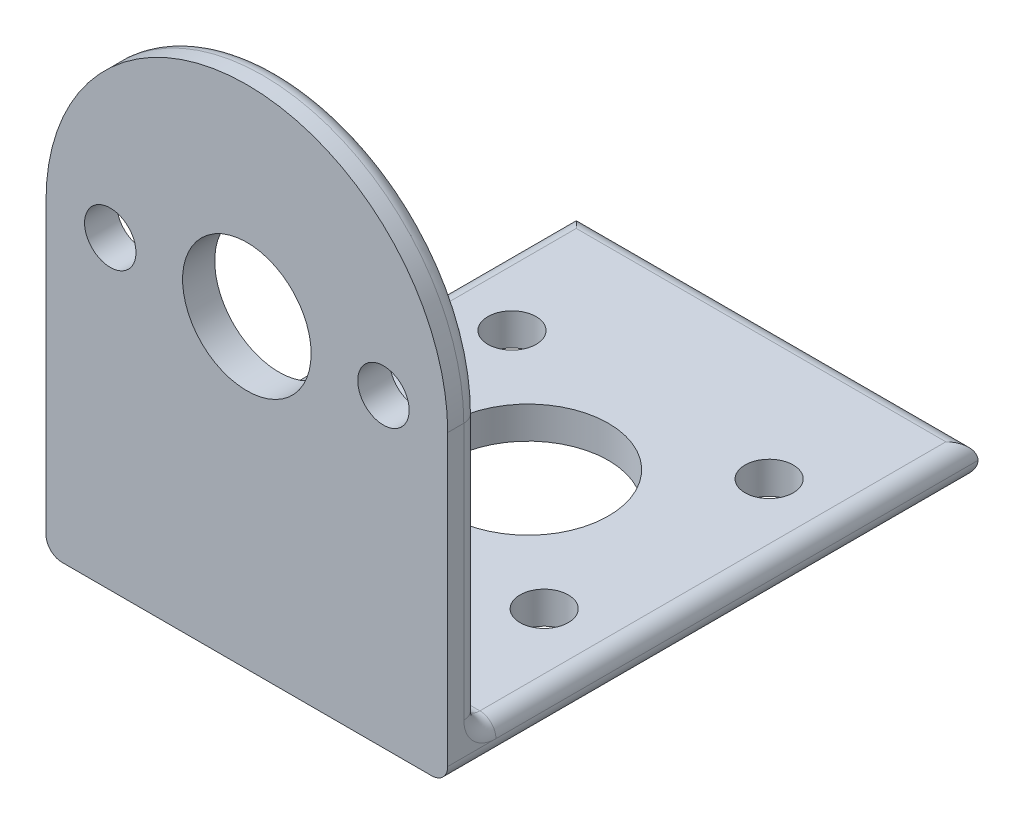
ISO-10303-21;
HEADER;
FILE_DESCRIPTION(('STEP AP214'),'2;1');
FILE_NAME('part.step','',(''),(''),'','','');
FILE_SCHEMA(('AUTOMOTIVE_DESIGN { 1 0 10303 214 1 1 1 1 }'));
ENDSEC;
DATA;
#1=APPLICATION_CONTEXT('core data for automotive mechanical design processes');
#2=APPLICATION_PROTOCOL_DEFINITION('international standard','automotive_design',2000,#1);
#3=PRODUCT_CONTEXT('',#1,'mechanical');
#4=PRODUCT('Part','Part','',(#3));
#5=PRODUCT_RELATED_PRODUCT_CATEGORY('part','',(#4));
#6=PRODUCT_DEFINITION_FORMATION('','',#4);
#7=PRODUCT_DEFINITION_CONTEXT('part definition',#1,'design');
#8=PRODUCT_DEFINITION('design','',#6,#7);
#9=PRODUCT_DEFINITION_SHAPE('','',#8);
#10=(LENGTH_UNIT() NAMED_UNIT(*) SI_UNIT(.MILLI.,.METRE.));
#11=(NAMED_UNIT(*) PLANE_ANGLE_UNIT() SI_UNIT($,.RADIAN.));
#12=(NAMED_UNIT(*) SI_UNIT($,.STERADIAN.) SOLID_ANGLE_UNIT());
#13=UNCERTAINTY_MEASURE_WITH_UNIT(LENGTH_MEASURE(1.E-05),#10,'distance_accuracy_value','');
#14=(GEOMETRIC_REPRESENTATION_CONTEXT(3) GLOBAL_UNCERTAINTY_ASSIGNED_CONTEXT((#13)) GLOBAL_UNIT_ASSIGNED_CONTEXT((#10,
#11,#12)) REPRESENTATION_CONTEXT('',''));
#15=CARTESIAN_POINT('',(0.,0.,0.));
#16=DIRECTION('',(0.,0.,1.));
#17=DIRECTION('',(1.,0.,0.));
#18=AXIS2_PLACEMENT_3D('',#15,#16,#17);
#19=CARTESIAN_POINT('',(25.,0.,2.));
#20=DIRECTION('',(0.,0.,-1.));
#21=DIRECTION('',(1.,0.,0.));
#22=AXIS2_PLACEMENT_3D('',#19,#20,#21);
#23=PLANE('',#22);
#24=CARTESIAN_POINT('',(4.,16.9999999999999,2.));
#25=DIRECTION('',(0.,0.,1.));
#26=DIRECTION('',(-1.,0.,0.));
#27=AXIS2_PLACEMENT_3D('',#24,#25,#26);
#28=CIRCLE('',#27,1.6);
#29=CARTESIAN_POINT('',(2.4,16.9999999999999,2.));
#30=VERTEX_POINT('',#29);
#31=EDGE_CURVE('E722',#30,#30,#28,.T.);
#32=ORIENTED_EDGE('',*,*,#31,.F.);
#33=EDGE_LOOP('',(#32));
#34=FACE_BOUND('',#33,.T.);
#35=CARTESIAN_POINT('',(21.,17.,2.));
#36=DIRECTION('',(0.,0.,1.));
#37=DIRECTION('',(1.,0.,0.));
#38=AXIS2_PLACEMENT_3D('',#35,#36,#37);
#39=CIRCLE('',#38,1.6);
#40=CARTESIAN_POINT('',(22.6,17.,2.));
#41=VERTEX_POINT('',#40);
#42=EDGE_CURVE('E714',#41,#41,#39,.T.);
#43=ORIENTED_EDGE('',*,*,#42,.F.);
#44=EDGE_LOOP('',(#43));
#45=FACE_BOUND('',#44,.T.);
#46=CARTESIAN_POINT('',(12.5,17.,2.));
#47=DIRECTION('',(0.,0.,1.));
#48=DIRECTION('',(1.,0.,0.));
#49=AXIS2_PLACEMENT_3D('',#46,#47,#48);
#50=CIRCLE('',#49,4.);
#51=CARTESIAN_POINT('',(16.5,17.,2.));
#52=VERTEX_POINT('',#51);
#53=EDGE_CURVE('E200',#52,#52,#50,.T.);
#54=ORIENTED_EDGE('',*,*,#53,.F.);
#55=EDGE_LOOP('',(#54));
#56=FACE_BOUND('',#55,.T.);
#57=DIRECTION('',(-1.,0.,0.));
#58=VECTOR('',#57,1.);
#59=CARTESIAN_POINT('',(25.,-2.,2.));
#60=LINE('',#59,#58);
#61=CARTESIAN_POINT('',(24.,-2.,2.));
#62=VERTEX_POINT('',#61);
#63=CARTESIAN_POINT('',(1.,-2.,2.));
#64=VERTEX_POINT('',#63);
#65=EDGE_CURVE('E262',#62,#64,#60,.T.);
#66=ORIENTED_EDGE('',*,*,#65,.F.);
#67=CARTESIAN_POINT('',(24.,-1.,2.));
#68=DIRECTION('',(0.,0.,1.));
#69=DIRECTION('',(1.,0.,0.));
#70=AXIS2_PLACEMENT_3D('',#67,#68,#69);
#71=CIRCLE('',#70,1.);
#72=CARTESIAN_POINT('',(25.,-1.,2.));
#73=VERTEX_POINT('',#72);
#74=EDGE_CURVE('E190',#73,#62,#71,.F.);
#75=ORIENTED_EDGE('',*,*,#74,.F.);
#76=DIRECTION('',(0.,1.,0.));
#77=VECTOR('',#76,1.);
#78=CARTESIAN_POINT('',(25.,0.,2.));
#79=LINE('',#78,#77);
#80=CARTESIAN_POINT('',(25.,17.,2.));
#81=VERTEX_POINT('',#80);
#82=EDGE_CURVE('E255',#73,#81,#79,.T.);
#83=ORIENTED_EDGE('',*,*,#82,.T.);
#84=CARTESIAN_POINT('',(12.5,17.,2.));
#85=DIRECTION('',(0.,0.,1.));
#86=DIRECTION('',(1.,0.,0.));
#87=AXIS2_PLACEMENT_3D('',#84,#85,#86);
#88=CIRCLE('',#87,12.5);
#89=CARTESIAN_POINT('',(0.,17.,2.));
#90=VERTEX_POINT('',#89);
#91=EDGE_CURVE('E248',#90,#81,#88,.F.);
#92=ORIENTED_EDGE('',*,*,#91,.F.);
#93=DIRECTION('',(0.,1.,0.));
#94=VECTOR('',#93,1.);
#95=CARTESIAN_POINT('',(0.,0.,2.));
#96=LINE('',#95,#94);
#97=CARTESIAN_POINT('',(0.,-1.,2.));
#98=VERTEX_POINT('',#97);
#99=EDGE_CURVE('E254',#98,#90,#96,.T.);
#100=ORIENTED_EDGE('',*,*,#99,.F.);
#101=CARTESIAN_POINT('',(1.,-1.,2.));
#102=DIRECTION('',(0.,0.,1.));
#103=DIRECTION('',(1.,0.,0.));
#104=AXIS2_PLACEMENT_3D('',#101,#102,#103);
#105=CIRCLE('',#104,1.);
#106=EDGE_CURVE('E180',#64,#98,#105,.F.);
#107=ORIENTED_EDGE('',*,*,#106,.F.);
#108=EDGE_LOOP('',(#66,#75,#83,#92,#100,#107));
#109=FACE_BOUND('',#108,.T.);
#110=ADVANCED_FACE('F49',(#34,#45,#56,#109),#23,.F.);
#111=CARTESIAN_POINT('',(25.,0.,0.));
#112=DIRECTION('',(0.,0.,-1.));
#113=DIRECTION('',(1.,0.,0.));
#114=AXIS2_PLACEMENT_3D('',#111,#112,#113);
#115=PLANE('',#114);
#116=CARTESIAN_POINT('',(4.,16.9999999999999,0.));
#117=DIRECTION('',(0.,0.,1.));
#118=DIRECTION('',(-1.,0.,0.));
#119=AXIS2_PLACEMENT_3D('',#116,#117,#118);
#120=CIRCLE('',#119,1.6);
#121=CARTESIAN_POINT('',(2.4,16.9999999999999,0.));
#122=VERTEX_POINT('',#121);
#123=EDGE_CURVE('E707',#122,#122,#120,.T.);
#124=ORIENTED_EDGE('',*,*,#123,.T.);
#125=EDGE_LOOP('',(#124));
#126=FACE_BOUND('',#125,.T.);
#127=CARTESIAN_POINT('',(21.,17.,0.));
#128=DIRECTION('',(0.,0.,1.));
#129=DIRECTION('',(1.,0.,0.));
#130=AXIS2_PLACEMENT_3D('',#127,#128,#129);
#131=CIRCLE('',#130,1.6);
#132=CARTESIAN_POINT('',(22.6,17.,0.));
#133=VERTEX_POINT('',#132);
#134=EDGE_CURVE('E719',#133,#133,#131,.T.);
#135=ORIENTED_EDGE('',*,*,#134,.T.);
#136=EDGE_LOOP('',(#135));
#137=FACE_BOUND('',#136,.T.);
#138=CARTESIAN_POINT('',(12.5,17.,0.));
#139=DIRECTION('',(0.,0.,1.));
#140=DIRECTION('',(1.,0.,0.));
#141=AXIS2_PLACEMENT_3D('',#138,#139,#140);
#142=CIRCLE('',#141,4.);
#143=CARTESIAN_POINT('',(16.5,17.,0.));
#144=VERTEX_POINT('',#143);
#145=EDGE_CURVE('E718',#144,#144,#142,.T.);
#146=ORIENTED_EDGE('',*,*,#145,.T.);
#147=EDGE_LOOP('',(#146));
#148=FACE_BOUND('',#147,.T.);
#149=DIRECTION('',(0.,1.,0.));
#150=VECTOR('',#149,1.);
#151=CARTESIAN_POINT('',(24.,17.,0.));
#152=LINE('',#151,#150);
#153=CARTESIAN_POINT('',(24.,1.,0.));
#154=VERTEX_POINT('',#153);
#155=CARTESIAN_POINT('',(24.,17.,0.));
#156=VERTEX_POINT('',#155);
#157=EDGE_CURVE('E273',#154,#156,#152,.T.);
#158=ORIENTED_EDGE('',*,*,#157,.F.);
#159=DIRECTION('',(-1.,0.,0.));
#160=VECTOR('',#159,1.);
#161=CARTESIAN_POINT('',(25.,1.,0.));
#162=LINE('',#161,#160);
#163=CARTESIAN_POINT('',(1.,1.,0.));
#164=VERTEX_POINT('',#163);
#165=EDGE_CURVE('E270',#164,#154,#162,.F.);
#166=ORIENTED_EDGE('',*,*,#165,.F.);
#167=DIRECTION('',(0.,1.,0.));
#168=VECTOR('',#167,1.);
#169=CARTESIAN_POINT('',(1.,0.,0.));
#170=LINE('',#169,#168);
#171=CARTESIAN_POINT('',(1.,17.,0.));
#172=VERTEX_POINT('',#171);
#173=EDGE_CURVE('E277',#172,#164,#170,.F.);
#174=ORIENTED_EDGE('',*,*,#173,.F.);
#175=CARTESIAN_POINT('',(12.5,17.,0.));
#176=DIRECTION('',(0.,0.,1.));
#177=DIRECTION('',(1.,0.,0.));
#178=AXIS2_PLACEMENT_3D('',#175,#176,#177);
#179=CIRCLE('',#178,11.5);
#180=EDGE_CURVE('E280',#156,#172,#179,.T.);
#181=ORIENTED_EDGE('',*,*,#180,.F.);
#182=EDGE_LOOP('',(#158,#166,#174,#181));
#183=FACE_BOUND('',#182,.T.);
#184=ADVANCED_FACE('F344',(#126,#137,#148,#183),#115,.T.);
#185=CARTESIAN_POINT('',(25.,0.,0.));
#186=DIRECTION('',(0.,1.,0.));
#187=DIRECTION('',(0.,0.,-1.));
#188=AXIS2_PLACEMENT_3D('',#185,#186,#187);
#189=PLANE('',#188);
#190=CARTESIAN_POINT('',(4.50000018958425,0.,-22.5));
#191=DIRECTION('',(0.,-1.,0.));
#192=DIRECTION('',(0.,0.,-1.));
#193=AXIS2_PLACEMENT_3D('',#190,#191,#192);
#194=CIRCLE('',#193,1.5);
#195=CARTESIAN_POINT('',(4.50000018958425,0.,-24.));
#196=VERTEX_POINT('',#195);
#197=EDGE_CURVE('E687',#196,#196,#194,.T.);
#198=ORIENTED_EDGE('',*,*,#197,.T.);
#199=EDGE_LOOP('',(#198));
#200=FACE_BOUND('',#199,.T.);
#201=CARTESIAN_POINT('',(20.5,0.,-8.50246306635849));
#202=DIRECTION('',(0.,-1.,0.));
#203=DIRECTION('',(0.,0.,-1.));
#204=AXIS2_PLACEMENT_3D('',#201,#202,#203);
#205=CIRCLE('',#204,1.5);
#206=CARTESIAN_POINT('',(20.5,0.,-10.0024630663585));
#207=VERTEX_POINT('',#206);
#208=EDGE_CURVE('E691',#207,#207,#205,.T.);
#209=ORIENTED_EDGE('',*,*,#208,.T.);
#210=EDGE_LOOP('',(#209));
#211=FACE_BOUND('',#210,.T.);
#212=CARTESIAN_POINT('',(4.50000018958425,0.,-8.5));
#213=DIRECTION('',(0.,-1.,0.));
#214=DIRECTION('',(0.,0.,-1.));
#215=AXIS2_PLACEMENT_3D('',#212,#213,#214);
#216=CIRCLE('',#215,1.5);
#217=CARTESIAN_POINT('',(4.50000018958425,0.,-10.));
#218=VERTEX_POINT('',#217);
#219=EDGE_CURVE('E695',#218,#218,#216,.T.);
#220=ORIENTED_EDGE('',*,*,#219,.T.);
#221=EDGE_LOOP('',(#220));
#222=FACE_BOUND('',#221,.T.);
#223=CARTESIAN_POINT('',(20.5,0.,-22.5024630663585));
#224=DIRECTION('',(0.,-1.,0.));
#225=DIRECTION('',(0.,0.,-1.));
#226=AXIS2_PLACEMENT_3D('',#223,#224,#225);
#227=CIRCLE('',#226,1.5);
#228=CARTESIAN_POINT('',(20.5,0.,-24.0024630663585));
#229=VERTEX_POINT('',#228);
#230=EDGE_CURVE('E698',#229,#229,#227,.T.);
#231=ORIENTED_EDGE('',*,*,#230,.T.);
#232=EDGE_LOOP('',(#231));
#233=FACE_BOUND('',#232,.T.);
#234=DIRECTION('',(-1.,0.,0.));
#235=VECTOR('',#234,1.);
#236=CARTESIAN_POINT('',(0.,0.,-1.));
#237=LINE('',#236,#235);
#238=CARTESIAN_POINT('',(24.,0.,-1.));
#239=VERTEX_POINT('',#238);
#240=CARTESIAN_POINT('',(1.,0.,-1.));
#241=VERTEX_POINT('',#240);
#242=EDGE_CURVE('E174',#239,#241,#237,.T.);
#243=ORIENTED_EDGE('',*,*,#242,.F.);
#244=DIRECTION('',(0.,0.,1.));
#245=VECTOR('',#244,1.);
#246=CARTESIAN_POINT('',(24.,0.,0.));
#247=LINE('',#246,#245);
#248=CARTESIAN_POINT('',(24.,0.,-30.));
#249=VERTEX_POINT('',#248);
#250=EDGE_CURVE('E179',#249,#239,#247,.T.);
#251=ORIENTED_EDGE('',*,*,#250,.F.);
#252=DIRECTION('',(-1.,0.,0.));
#253=VECTOR('',#252,1.);
#254=CARTESIAN_POINT('',(25.,0.,-30.));
#255=LINE('',#254,#253);
#256=CARTESIAN_POINT('',(1.,0.,-30.));
#257=VERTEX_POINT('',#256);
#258=EDGE_CURVE('E60',#257,#249,#255,.F.);
#259=ORIENTED_EDGE('',*,*,#258,.F.);
#260=DIRECTION('',(0.,0.,1.));
#261=VECTOR('',#260,1.);
#262=CARTESIAN_POINT('',(1.,0.,0.));
#263=LINE('',#262,#261);
#264=EDGE_CURVE('E11',#241,#257,#263,.F.);
#265=ORIENTED_EDGE('',*,*,#264,.F.);
#266=EDGE_LOOP('',(#243,#251,#259,#265));
#267=FACE_BOUND('',#266,.T.);
#268=CARTESIAN_POINT('',(12.5,0.,-15.5));
#269=DIRECTION('',(0.,-1.,0.));
#270=DIRECTION('',(0.,0.,-1.));
#271=AXIS2_PLACEMENT_3D('',#268,#269,#270);
#272=CIRCLE('',#271,5.);
#273=CARTESIAN_POINT('',(12.5,0.,-20.5));
#274=VERTEX_POINT('',#273);
#275=EDGE_CURVE('E231',#274,#274,#272,.T.);
#276=ORIENTED_EDGE('',*,*,#275,.T.);
#277=EDGE_LOOP('',(#276));
#278=FACE_BOUND('',#277,.T.);
#279=ADVANCED_FACE('F171',(#200,#211,#222,#233,#267,#278),#189,.T.);
#280=CARTESIAN_POINT('',(25.,-2.,0.));
#281=DIRECTION('',(0.,1.,0.));
#282=DIRECTION('',(0.,0.,-1.));
#283=AXIS2_PLACEMENT_3D('',#280,#281,#282);
#284=PLANE('',#283);
#285=CARTESIAN_POINT('',(4.50000018958425,-2.00000000000001,-22.5));
#286=DIRECTION('',(0.,-1.,0.));
#287=DIRECTION('',(0.,0.,-1.));
#288=AXIS2_PLACEMENT_3D('',#285,#286,#287);
#289=CIRCLE('',#288,1.5);
#290=CARTESIAN_POINT('',(4.50000018958425,-2.00000000000001,-24.));
#291=VERTEX_POINT('',#290);
#292=EDGE_CURVE('E702',#291,#291,#289,.T.);
#293=ORIENTED_EDGE('',*,*,#292,.F.);
#294=EDGE_LOOP('',(#293));
#295=FACE_BOUND('',#294,.T.);
#296=CARTESIAN_POINT('',(20.5,-2.00000000000001,-8.50246306635849));
#297=DIRECTION('',(0.,-1.,0.));
#298=DIRECTION('',(0.,0.,-1.));
#299=AXIS2_PLACEMENT_3D('',#296,#297,#298);
#300=CIRCLE('',#299,1.5);
#301=CARTESIAN_POINT('',(20.5,-2.00000000000001,-10.0024630663585));
#302=VERTEX_POINT('',#301);
#303=EDGE_CURVE('E744',#302,#302,#300,.T.);
#304=ORIENTED_EDGE('',*,*,#303,.F.);
#305=EDGE_LOOP('',(#304));
#306=FACE_BOUND('',#305,.T.);
#307=CARTESIAN_POINT('',(4.50000018958425,-2.00000000000001,-8.5));
#308=DIRECTION('',(0.,-1.,0.));
#309=DIRECTION('',(0.,0.,-1.));
#310=AXIS2_PLACEMENT_3D('',#307,#308,#309);
#311=CIRCLE('',#310,1.5);
#312=CARTESIAN_POINT('',(4.50000018958425,-2.00000000000001,-10.));
#313=VERTEX_POINT('',#312);
#314=EDGE_CURVE('E754',#313,#313,#311,.T.);
#315=ORIENTED_EDGE('',*,*,#314,.F.);
#316=EDGE_LOOP('',(#315));
#317=FACE_BOUND('',#316,.T.);
#318=CARTESIAN_POINT('',(20.5,-2.00000000000001,-22.5024630663585));
#319=DIRECTION('',(0.,-1.,0.));
#320=DIRECTION('',(0.,0.,-1.));
#321=AXIS2_PLACEMENT_3D('',#318,#319,#320);
#322=CIRCLE('',#321,1.5);
#323=CARTESIAN_POINT('',(20.5,-2.00000000000001,-24.0024630663585));
#324=VERTEX_POINT('',#323);
#325=EDGE_CURVE('E701',#324,#324,#322,.T.);
#326=ORIENTED_EDGE('',*,*,#325,.F.);
#327=EDGE_LOOP('',(#326));
#328=FACE_BOUND('',#327,.T.);
#329=CARTESIAN_POINT('',(12.5,-2.00000000000001,-15.5));
#330=DIRECTION('',(0.,-1.,0.));
#331=DIRECTION('',(0.,0.,-1.));
#332=AXIS2_PLACEMENT_3D('',#329,#330,#331);
#333=CIRCLE('',#332,5.);
#334=CARTESIAN_POINT('',(12.5,-2.00000000000001,-20.5));
#335=VERTEX_POINT('',#334);
#336=EDGE_CURVE('E240',#335,#335,#333,.T.);
#337=ORIENTED_EDGE('',*,*,#336,.F.);
#338=EDGE_LOOP('',(#337));
#339=FACE_BOUND('',#338,.T.);
#340=DIRECTION('',(-1.,0.,0.));
#341=VECTOR('',#340,1.);
#342=CARTESIAN_POINT('',(0.,-2.,-30.));
#343=LINE('',#342,#341);
#344=CARTESIAN_POINT('',(24.,-2.,-30.));
#345=VERTEX_POINT('',#344);
#346=CARTESIAN_POINT('',(1.,-2.,-30.));
#347=VERTEX_POINT('',#346);
#348=EDGE_CURVE('E309',#345,#347,#343,.T.);
#349=ORIENTED_EDGE('',*,*,#348,.F.);
#350=DIRECTION('',(0.,0.,1.));
#351=VECTOR('',#350,1.);
#352=CARTESIAN_POINT('',(24.,-2.,0.));
#353=LINE('',#352,#351);
#354=EDGE_CURVE('E312',#62,#345,#353,.F.);
#355=ORIENTED_EDGE('',*,*,#354,.F.);
#356=ORIENTED_EDGE('',*,*,#65,.T.);
#357=DIRECTION('',(0.,0.,1.));
#358=VECTOR('',#357,1.);
#359=CARTESIAN_POINT('',(1.,-2.,2.));
#360=LINE('',#359,#358);
#361=EDGE_CURVE('E315',#347,#64,#360,.T.);
#362=ORIENTED_EDGE('',*,*,#361,.F.);
#363=EDGE_LOOP('',(#349,#355,#356,#362));
#364=FACE_BOUND('',#363,.T.);
#365=ADVANCED_FACE('F330',(#295,#306,#317,#328,#339,#364),#284,.F.);
#366=CARTESIAN_POINT('',(25.,0.,0.));
#367=DIRECTION('',(-1.,0.,0.));
#368=DIRECTION('',(0.,0.,-1.));
#369=AXIS2_PLACEMENT_3D('',#366,#367,#368);
#370=PLANE('',#369);
#371=DIRECTION('',(0.,0.,1.));
#372=VECTOR('',#371,1.);
#373=CARTESIAN_POINT('',(25.,17.,0.));
#374=LINE('',#373,#372);
#375=CARTESIAN_POINT('',(25.,17.,1.));
#376=VERTEX_POINT('',#375);
#377=EDGE_CURVE('E92',#376,#81,#374,.T.);
#378=ORIENTED_EDGE('',*,*,#377,.T.);
#379=ORIENTED_EDGE('',*,*,#82,.F.);
#380=DIRECTION('',(0.,0.,1.));
#381=VECTOR('',#380,1.);
#382=CARTESIAN_POINT('',(25.,-1.,0.));
#383=LINE('',#382,#381);
#384=CARTESIAN_POINT('',(25.,-1.,-1.));
#385=VERTEX_POINT('',#384);
#386=EDGE_CURVE('E298',#385,#73,#383,.T.);
#387=ORIENTED_EDGE('',*,*,#386,.F.);
#388=CARTESIAN_POINT('',(25.,1.,-1.));
#389=DIRECTION('',(1.,0.,0.));
#390=DIRECTION('',(0.,0.,-1.));
#391=AXIS2_PLACEMENT_3D('',#388,#389,#390);
#392=CIRCLE('',#391,2.);
#393=CARTESIAN_POINT('',(25.,1.,1.));
#394=VERTEX_POINT('',#393);
#395=EDGE_CURVE('E301',#385,#394,#392,.F.);
#396=ORIENTED_EDGE('',*,*,#395,.T.);
#397=DIRECTION('',(0.,1.,0.));
#398=VECTOR('',#397,1.);
#399=CARTESIAN_POINT('',(25.,0.,1.));
#400=LINE('',#399,#398);
#401=EDGE_CURVE('E305',#376,#394,#400,.F.);
#402=ORIENTED_EDGE('',*,*,#401,.F.);
#403=EDGE_LOOP('',(#378,#379,#387,#396,#402));
#404=FACE_BOUND('',#403,.T.);
#405=ADVANCED_FACE('F594',(#404),#370,.F.);
#406=CARTESIAN_POINT('',(0.,0.,0.));
#407=DIRECTION('',(-1.,0.,0.));
#408=DIRECTION('',(0.,0.,-1.));
#409=AXIS2_PLACEMENT_3D('',#406,#407,#408);
#410=PLANE('',#409);
#411=CARTESIAN_POINT('',(0.,1.,-1.));
#412=DIRECTION('',(1.,0.,0.));
#413=DIRECTION('',(0.,0.,-1.));
#414=AXIS2_PLACEMENT_3D('',#411,#412,#413);
#415=CIRCLE('',#414,2.);
#416=CARTESIAN_POINT('',(0.,1.,1.));
#417=VERTEX_POINT('',#416);
#418=CARTESIAN_POINT('',(0.,-1.,-1.));
#419=VERTEX_POINT('',#418);
#420=EDGE_CURVE('E287',#417,#419,#415,.T.);
#421=ORIENTED_EDGE('',*,*,#420,.T.);
#422=DIRECTION('',(0.,0.,1.));
#423=VECTOR('',#422,1.);
#424=CARTESIAN_POINT('',(0.,-1.,-31.));
#425=LINE('',#424,#423);
#426=EDGE_CURVE('E291',#98,#419,#425,.F.);
#427=ORIENTED_EDGE('',*,*,#426,.F.);
#428=ORIENTED_EDGE('',*,*,#99,.T.);
#429=DIRECTION('',(0.,0.,1.));
#430=VECTOR('',#429,1.);
#431=CARTESIAN_POINT('',(0.,17.,0.));
#432=LINE('',#431,#430);
#433=CARTESIAN_POINT('',(0.,17.,1.));
#434=VERTEX_POINT('',#433);
#435=EDGE_CURVE('E259',#434,#90,#432,.T.);
#436=ORIENTED_EDGE('',*,*,#435,.F.);
#437=DIRECTION('',(0.,1.,0.));
#438=VECTOR('',#437,1.);
#439=CARTESIAN_POINT('',(0.,0.,1.));
#440=LINE('',#439,#438);
#441=EDGE_CURVE('E294',#417,#434,#440,.T.);
#442=ORIENTED_EDGE('',*,*,#441,.F.);
#443=EDGE_LOOP('',(#421,#427,#428,#436,#442));
#444=FACE_BOUND('',#443,.T.);
#445=ADVANCED_FACE('F335',(#444),#410,.T.);
#446=CARTESIAN_POINT('',(12.5,17.,40.6684626019706));
#447=DIRECTION('',(0.,0.,-1.));
#448=DIRECTION('',(1.,0.,0.));
#449=AXIS2_PLACEMENT_3D('',#446,#447,#448);
#450=CYLINDRICAL_SURFACE('',#449,12.5);
#451=ORIENTED_EDGE('',*,*,#435,.T.);
#452=ORIENTED_EDGE('',*,*,#91,.T.);
#453=ORIENTED_EDGE('',*,*,#377,.F.);
#454=CARTESIAN_POINT('',(12.5,17.,1.));
#455=DIRECTION('',(0.,0.,1.));
#456=DIRECTION('',(1.,0.,0.));
#457=AXIS2_PLACEMENT_3D('',#454,#455,#456);
#458=CIRCLE('',#457,12.5);
#459=EDGE_CURVE('E284',#434,#376,#458,.F.);
#460=ORIENTED_EDGE('',*,*,#459,.F.);
#461=EDGE_LOOP('',(#451,#452,#453,#460));
#462=FACE_BOUND('',#461,.T.);
#463=ADVANCED_FACE('F573',(#462),#450,.T.);
#464=CARTESIAN_POINT('',(12.5,-2.00000000000001,-15.5));
#465=DIRECTION('',(0.,1.,0.));
#466=DIRECTION('',(0.,0.,-1.));
#467=AXIS2_PLACEMENT_3D('',#464,#465,#466);
#468=CYLINDRICAL_SURFACE('',#467,5.);
#469=ORIENTED_EDGE('',*,*,#336,.T.);
#470=EDGE_LOOP('',(#469));
#471=FACE_BOUND('',#470,.T.);
#472=ORIENTED_EDGE('',*,*,#275,.F.);
#473=EDGE_LOOP('',(#472));
#474=FACE_BOUND('',#473,.T.);
#475=ADVANCED_FACE('F564',(#471,#474),#468,.F.);
#476=CARTESIAN_POINT('',(25.,-1.,-30.));
#477=DIRECTION('',(1.,0.,0.));
#478=DIRECTION('',(0.,0.,1.));
#479=AXIS2_PLACEMENT_3D('',#476,#477,#478);
#480=CYLINDRICAL_SURFACE('',#479,1.);
#481=CARTESIAN_POINT('',(1.,-1.,-30.));
#482=DIRECTION('',(-0.707106781186547,0.,0.707106781186547));
#483=DIRECTION('',(0.707106781186547,0.,0.707106781186547));
#484=AXIS2_PLACEMENT_3D('',#481,#482,#483);
#485=ELLIPSE('',#484,1.41421356237309,1.);
#486=CARTESIAN_POINT('',(0.,-1.,-31.));
#487=VERTEX_POINT('',#486);
#488=EDGE_CURVE('E222',#347,#487,#485,.F.);
#489=ORIENTED_EDGE('',*,*,#488,.T.);
#490=DIRECTION('',(-1.,0.,0.));
#491=VECTOR('',#490,1.);
#492=CARTESIAN_POINT('',(25.,-1.,-31.));
#493=LINE('',#492,#491);
#494=CARTESIAN_POINT('',(25.,-1.,-31.));
#495=VERTEX_POINT('',#494);
#496=EDGE_CURVE('E225',#487,#495,#493,.F.);
#497=ORIENTED_EDGE('',*,*,#496,.T.);
#498=CARTESIAN_POINT('',(24.,-1.,-30.));
#499=DIRECTION('',(-0.707106781186547,0.,-0.707106781186547));
#500=DIRECTION('',(0.707106781186547,0.,-0.707106781186547));
#501=AXIS2_PLACEMENT_3D('',#498,#499,#500);
#502=ELLIPSE('',#501,1.41421356237309,1.);
#503=EDGE_CURVE('E53',#495,#345,#502,.T.);
#504=ORIENTED_EDGE('',*,*,#503,.T.);
#505=ORIENTED_EDGE('',*,*,#348,.T.);
#506=EDGE_LOOP('',(#489,#497,#504,#505));
#507=FACE_BOUND('',#506,.T.);
#508=ADVANCED_FACE('F51',(#507),#480,.T.);
#509=CARTESIAN_POINT('',(24.,-1.,0.));
#510=DIRECTION('',(0.,0.,1.));
#511=DIRECTION('',(0.,1.,0.));
#512=AXIS2_PLACEMENT_3D('',#509,#510,#511);
#513=CYLINDRICAL_SURFACE('',#512,1.);
#514=ORIENTED_EDGE('',*,*,#74,.T.);
#515=ORIENTED_EDGE('',*,*,#354,.T.);
#516=ORIENTED_EDGE('',*,*,#503,.F.);
#517=DIRECTION('',(0.,0.,1.));
#518=VECTOR('',#517,1.);
#519=CARTESIAN_POINT('',(25.,-1.,0.));
#520=LINE('',#519,#518);
#521=EDGE_CURVE('E218',#495,#385,#520,.T.);
#522=ORIENTED_EDGE('',*,*,#521,.T.);
#523=ORIENTED_EDGE('',*,*,#386,.T.);
#524=EDGE_LOOP('',(#514,#515,#516,#522,#523));
#525=FACE_BOUND('',#524,.T.);
#526=ADVANCED_FACE('F322',(#525),#513,.T.);
#527=CARTESIAN_POINT('',(25.,-1.,-30.));
#528=DIRECTION('',(-1.,0.,0.));
#529=DIRECTION('',(0.,0.,-1.));
#530=AXIS2_PLACEMENT_3D('',#527,#528,#529);
#531=CYLINDRICAL_SURFACE('',#530,1.);
#532=CARTESIAN_POINT('',(1.,-1.,-30.));
#533=DIRECTION('',(0.707106781186547,0.,-0.707106781186547));
#534=DIRECTION('',(-0.707106781186547,0.,-0.707106781186547));
#535=AXIS2_PLACEMENT_3D('',#532,#533,#534);
#536=ELLIPSE('',#535,1.41421356237309,1.);
#537=EDGE_CURVE('E69',#487,#257,#536,.T.);
#538=ORIENTED_EDGE('',*,*,#537,.T.);
#539=ORIENTED_EDGE('',*,*,#258,.T.);
#540=CARTESIAN_POINT('',(24.,-1.,-30.));
#541=DIRECTION('',(0.707106781186547,0.,0.707106781186547));
#542=DIRECTION('',(0.707106781186547,0.,-0.707106781186547));
#543=AXIS2_PLACEMENT_3D('',#540,#541,#542);
#544=ELLIPSE('',#543,1.41421356237309,1.);
#545=EDGE_CURVE('E83',#249,#495,#544,.F.);
#546=ORIENTED_EDGE('',*,*,#545,.T.);
#547=ORIENTED_EDGE('',*,*,#496,.F.);
#548=EDGE_LOOP('',(#538,#539,#546,#547));
#549=FACE_BOUND('',#548,.T.);
#550=ADVANCED_FACE('F352',(#549),#531,.T.);
#551=CARTESIAN_POINT('',(1.,-1.,0.));
#552=DIRECTION('',(0.,0.,-1.));
#553=DIRECTION('',(0.,-1.,0.));
#554=AXIS2_PLACEMENT_3D('',#551,#552,#553);
#555=CYLINDRICAL_SURFACE('',#554,1.);
#556=ORIENTED_EDGE('',*,*,#361,.T.);
#557=ORIENTED_EDGE('',*,*,#106,.T.);
#558=ORIENTED_EDGE('',*,*,#426,.T.);
#559=DIRECTION('',(0.,0.,1.));
#560=VECTOR('',#559,1.);
#561=CARTESIAN_POINT('',(0.,-1.,-31.));
#562=LINE('',#561,#560);
#563=EDGE_CURVE('E80',#419,#487,#562,.F.);
#564=ORIENTED_EDGE('',*,*,#563,.T.);
#565=ORIENTED_EDGE('',*,*,#488,.F.);
#566=EDGE_LOOP('',(#556,#557,#558,#564,#565));
#567=FACE_BOUND('',#566,.T.);
#568=ADVANCED_FACE('F331',(#567),#555,.T.);
#569=CARTESIAN_POINT('',(24.,-1.,0.));
#570=DIRECTION('',(0.,0.,-1.));
#571=DIRECTION('',(0.,-1.,0.));
#572=AXIS2_PLACEMENT_3D('',#569,#570,#571);
#573=CYLINDRICAL_SURFACE('',#572,1.);
#574=ORIENTED_EDGE('',*,*,#545,.F.);
#575=ORIENTED_EDGE('',*,*,#250,.T.);
#576=CARTESIAN_POINT('',(24.,-1.,-1.));
#577=DIRECTION('',(0.,0.,-1.));
#578=DIRECTION('',(0.,1.,0.));
#579=AXIS2_PLACEMENT_3D('',#576,#577,#578);
#580=CIRCLE('',#579,1.);
#581=EDGE_CURVE('E209',#239,#385,#580,.T.);
#582=ORIENTED_EDGE('',*,*,#581,.T.);
#583=ORIENTED_EDGE('',*,*,#521,.F.);
#584=EDGE_LOOP('',(#574,#575,#582,#583));
#585=FACE_BOUND('',#584,.T.);
#586=ADVANCED_FACE('F351',(#585),#573,.T.);
#587=CARTESIAN_POINT('',(25.,1.,-1.));
#588=DIRECTION('',(1.,0.,0.));
#589=DIRECTION('',(0.,0.,1.));
#590=AXIS2_PLACEMENT_3D('',#587,#588,#589);
#591=CYLINDRICAL_SURFACE('',#590,1.);
#592=CARTESIAN_POINT('',(1.,1.,-1.));
#593=DIRECTION('',(1.,0.,0.));
#594=DIRECTION('',(0.,0.,-1.));
#595=AXIS2_PLACEMENT_3D('',#592,#593,#594);
#596=CIRCLE('',#595,1.);
#597=EDGE_CURVE('E156',#241,#164,#596,.F.);
#598=ORIENTED_EDGE('',*,*,#597,.T.);
#599=ORIENTED_EDGE('',*,*,#165,.T.);
#600=CARTESIAN_POINT('',(24.,1.,-1.));
#601=DIRECTION('',(1.,0.,0.));
#602=DIRECTION('',(0.,0.,-1.));
#603=AXIS2_PLACEMENT_3D('',#600,#601,#602);
#604=CIRCLE('',#603,1.);
#605=EDGE_CURVE('E167',#154,#239,#604,.T.);
#606=ORIENTED_EDGE('',*,*,#605,.T.);
#607=ORIENTED_EDGE('',*,*,#242,.T.);
#608=EDGE_LOOP('',(#598,#599,#606,#607));
#609=FACE_BOUND('',#608,.T.);
#610=ADVANCED_FACE('F175',(#609),#591,.F.);
#611=CARTESIAN_POINT('',(1.,-1.,0.));
#612=DIRECTION('',(0.,0.,1.));
#613=DIRECTION('',(0.,1.,0.));
#614=AXIS2_PLACEMENT_3D('',#611,#612,#613);
#615=CYLINDRICAL_SURFACE('',#614,1.);
#616=ORIENTED_EDGE('',*,*,#537,.F.);
#617=ORIENTED_EDGE('',*,*,#563,.F.);
#618=CARTESIAN_POINT('',(1.,-1.,-1.));
#619=DIRECTION('',(0.,0.,-1.));
#620=DIRECTION('',(0.,1.,0.));
#621=AXIS2_PLACEMENT_3D('',#618,#619,#620);
#622=CIRCLE('',#621,1.);
#623=EDGE_CURVE('E148',#419,#241,#622,.T.);
#624=ORIENTED_EDGE('',*,*,#623,.T.);
#625=ORIENTED_EDGE('',*,*,#264,.T.);
#626=EDGE_LOOP('',(#616,#617,#624,#625));
#627=FACE_BOUND('',#626,.T.);
#628=ADVANCED_FACE('F150',(#627),#615,.T.);
#629=CARTESIAN_POINT('',(24.,1.,-1.));
#630=DIRECTION('',(-1.,0.,0.));
#631=DIRECTION('',(0.,0.,-1.));
#632=AXIS2_PLACEMENT_3D('',#629,#630,#631);
#633=TOROIDAL_SURFACE('',#632,2.,1.);
#634=ORIENTED_EDGE('',*,*,#581,.F.);
#635=ORIENTED_EDGE('',*,*,#605,.F.);
#636=CARTESIAN_POINT('',(24.,1.,1.));
#637=DIRECTION('',(0.,1.,0.));
#638=DIRECTION('',(0.,0.,1.));
#639=AXIS2_PLACEMENT_3D('',#636,#637,#638);
#640=CIRCLE('',#639,1.);
#641=EDGE_CURVE('E157',#154,#394,#640,.F.);
#642=ORIENTED_EDGE('',*,*,#641,.T.);
#643=ORIENTED_EDGE('',*,*,#395,.F.);
#644=EDGE_LOOP('',(#634,#635,#642,#643));
#645=FACE_BOUND('',#644,.T.);
#646=ADVANCED_FACE('F349',(#645),#633,.T.);
#647=CARTESIAN_POINT('',(1.,1.,-1.));
#648=DIRECTION('',(-1.,0.,0.));
#649=DIRECTION('',(0.,0.,-1.));
#650=AXIS2_PLACEMENT_3D('',#647,#648,#649);
#651=TOROIDAL_SURFACE('',#650,2.,1.);
#652=ORIENTED_EDGE('',*,*,#623,.F.);
#653=ORIENTED_EDGE('',*,*,#420,.F.);
#654=CARTESIAN_POINT('',(1.,1.,1.));
#655=DIRECTION('',(0.,1.,0.));
#656=DIRECTION('',(0.,0.,1.));
#657=AXIS2_PLACEMENT_3D('',#654,#655,#656);
#658=CIRCLE('',#657,1.);
#659=EDGE_CURVE('E161',#417,#164,#658,.F.);
#660=ORIENTED_EDGE('',*,*,#659,.T.);
#661=ORIENTED_EDGE('',*,*,#597,.F.);
#662=EDGE_LOOP('',(#652,#653,#660,#661));
#663=FACE_BOUND('',#662,.T.);
#664=ADVANCED_FACE('F160',(#663),#651,.T.);
#665=CARTESIAN_POINT('',(24.,0.,1.));
#666=DIRECTION('',(0.,-1.,0.));
#667=DIRECTION('',(0.,0.,1.));
#668=AXIS2_PLACEMENT_3D('',#665,#666,#667);
#669=CYLINDRICAL_SURFACE('',#668,1.);
#670=ORIENTED_EDGE('',*,*,#641,.F.);
#671=ORIENTED_EDGE('',*,*,#157,.T.);
#672=CARTESIAN_POINT('',(24.,17.,1.));
#673=DIRECTION('',(0.,-1.,0.));
#674=DIRECTION('',(0.,0.,-1.));
#675=AXIS2_PLACEMENT_3D('',#672,#673,#674);
#676=CIRCLE('',#675,1.);
#677=EDGE_CURVE('E199',#156,#376,#676,.T.);
#678=ORIENTED_EDGE('',*,*,#677,.T.);
#679=ORIENTED_EDGE('',*,*,#401,.T.);
#680=EDGE_LOOP('',(#670,#671,#678,#679));
#681=FACE_BOUND('',#680,.T.);
#682=ADVANCED_FACE('F346',(#681),#669,.T.);
#683=CARTESIAN_POINT('',(1.,0.,1.));
#684=DIRECTION('',(0.,1.,0.));
#685=DIRECTION('',(0.,0.,-1.));
#686=AXIS2_PLACEMENT_3D('',#683,#684,#685);
#687=CYLINDRICAL_SURFACE('',#686,1.);
#688=ORIENTED_EDGE('',*,*,#659,.F.);
#689=ORIENTED_EDGE('',*,*,#441,.T.);
#690=CARTESIAN_POINT('',(1.,17.,1.));
#691=DIRECTION('',(0.,-1.,0.));
#692=DIRECTION('',(0.,0.,-1.));
#693=AXIS2_PLACEMENT_3D('',#690,#691,#692);
#694=CIRCLE('',#693,1.);
#695=EDGE_CURVE('E196',#434,#172,#694,.T.);
#696=ORIENTED_EDGE('',*,*,#695,.T.);
#697=ORIENTED_EDGE('',*,*,#173,.T.);
#698=EDGE_LOOP('',(#688,#689,#696,#697));
#699=FACE_BOUND('',#698,.T.);
#700=ADVANCED_FACE('F338',(#699),#687,.T.);
#701=CARTESIAN_POINT('',(12.5,17.,1.));
#702=DIRECTION('',(0.,0.,-1.));
#703=DIRECTION('',(1.,0.,0.));
#704=AXIS2_PLACEMENT_3D('',#701,#702,#703);
#705=TOROIDAL_SURFACE('',#704,11.5,1.);
#706=ORIENTED_EDGE('',*,*,#677,.F.);
#707=ORIENTED_EDGE('',*,*,#180,.T.);
#708=ORIENTED_EDGE('',*,*,#695,.F.);
#709=ORIENTED_EDGE('',*,*,#459,.T.);
#710=EDGE_LOOP('',(#706,#707,#708,#709));
#711=FACE_BOUND('',#710,.T.);
#712=ADVANCED_FACE('F372',(#711),#705,.T.);
#713=CARTESIAN_POINT('',(12.5,17.,2.));
#714=DIRECTION('',(0.,0.,-1.));
#715=DIRECTION('',(1.,0.,0.));
#716=AXIS2_PLACEMENT_3D('',#713,#714,#715);
#717=CYLINDRICAL_SURFACE('',#716,4.);
#718=ORIENTED_EDGE('',*,*,#53,.T.);
#719=EDGE_LOOP('',(#718));
#720=FACE_BOUND('',#719,.T.);
#721=ORIENTED_EDGE('',*,*,#145,.F.);
#722=EDGE_LOOP('',(#721));
#723=FACE_BOUND('',#722,.T.);
#724=ADVANCED_FACE('F375',(#720,#723),#717,.F.);
#725=CARTESIAN_POINT('',(21.,17.,2.));
#726=DIRECTION('',(0.,0.,-1.));
#727=DIRECTION('',(1.,0.,0.));
#728=AXIS2_PLACEMENT_3D('',#725,#726,#727);
#729=CYLINDRICAL_SURFACE('',#728,1.6);
#730=ORIENTED_EDGE('',*,*,#42,.T.);
#731=EDGE_LOOP('',(#730));
#732=FACE_BOUND('',#731,.T.);
#733=ORIENTED_EDGE('',*,*,#134,.F.);
#734=EDGE_LOOP('',(#733));
#735=FACE_BOUND('',#734,.T.);
#736=ADVANCED_FACE('F420',(#732,#735),#729,.F.);
#737=CARTESIAN_POINT('',(4.,16.9999999999999,2.));
#738=DIRECTION('',(0.,0.,-1.));
#739=DIRECTION('',(1.,0.,0.));
#740=AXIS2_PLACEMENT_3D('',#737,#738,#739);
#741=CYLINDRICAL_SURFACE('',#740,1.6);
#742=ORIENTED_EDGE('',*,*,#31,.T.);
#743=EDGE_LOOP('',(#742));
#744=FACE_BOUND('',#743,.T.);
#745=ORIENTED_EDGE('',*,*,#123,.F.);
#746=EDGE_LOOP('',(#745));
#747=FACE_BOUND('',#746,.T.);
#748=ADVANCED_FACE('F427',(#744,#747),#741,.F.);
#749=CARTESIAN_POINT('',(20.5,-2.00000000000001,-22.5024630663585));
#750=DIRECTION('',(0.,1.,0.));
#751=DIRECTION('',(0.,0.,-1.));
#752=AXIS2_PLACEMENT_3D('',#749,#750,#751);
#753=CYLINDRICAL_SURFACE('',#752,1.5);
#754=ORIENTED_EDGE('',*,*,#325,.T.);
#755=EDGE_LOOP('',(#754));
#756=FACE_BOUND('',#755,.T.);
#757=ORIENTED_EDGE('',*,*,#230,.F.);
#758=EDGE_LOOP('',(#757));
#759=FACE_BOUND('',#758,.T.);
#760=ADVANCED_FACE('F434',(#756,#759),#753,.F.);
#761=CARTESIAN_POINT('',(4.50000018958425,-2.00000000000001,-8.5));
#762=DIRECTION('',(0.,1.,0.));
#763=DIRECTION('',(0.,0.,-1.));
#764=AXIS2_PLACEMENT_3D('',#761,#762,#763);
#765=CYLINDRICAL_SURFACE('',#764,1.5);
#766=ORIENTED_EDGE('',*,*,#314,.T.);
#767=EDGE_LOOP('',(#766));
#768=FACE_BOUND('',#767,.T.);
#769=ORIENTED_EDGE('',*,*,#219,.F.);
#770=EDGE_LOOP('',(#769));
#771=FACE_BOUND('',#770,.T.);
#772=ADVANCED_FACE('F441',(#768,#771),#765,.F.);
#773=CARTESIAN_POINT('',(20.5,-2.00000000000001,-8.50246306635849));
#774=DIRECTION('',(0.,1.,0.));
#775=DIRECTION('',(0.,0.,-1.));
#776=AXIS2_PLACEMENT_3D('',#773,#774,#775);
#777=CYLINDRICAL_SURFACE('',#776,1.5);
#778=ORIENTED_EDGE('',*,*,#303,.T.);
#779=EDGE_LOOP('',(#778));
#780=FACE_BOUND('',#779,.T.);
#781=ORIENTED_EDGE('',*,*,#208,.F.);
#782=EDGE_LOOP('',(#781));
#783=FACE_BOUND('',#782,.T.);
#784=ADVANCED_FACE('F448',(#780,#783),#777,.F.);
#785=CARTESIAN_POINT('',(4.50000018958425,-2.00000000000001,-22.5));
#786=DIRECTION('',(0.,1.,0.));
#787=DIRECTION('',(0.,0.,-1.));
#788=AXIS2_PLACEMENT_3D('',#785,#786,#787);
#789=CYLINDRICAL_SURFACE('',#788,1.5);
#790=ORIENTED_EDGE('',*,*,#292,.T.);
#791=EDGE_LOOP('',(#790));
#792=FACE_BOUND('',#791,.T.);
#793=ORIENTED_EDGE('',*,*,#197,.F.);
#794=EDGE_LOOP('',(#793));
#795=FACE_BOUND('',#794,.T.);
#796=ADVANCED_FACE('F455',(#792,#795),#789,.F.);
#797=CLOSED_SHELL('',(#110,#184,#279,#365,#405,#445,#463,#475,#508,#526,#550,#568,#586,#610,
#628,#646,#664,#682,#700,#712,#724,#736,#748,#760,#772,#784,#796));
#798=MANIFOLD_SOLID_BREP('B2',#797);
#799=ADVANCED_BREP_SHAPE_REPRESENTATION('',(#18,#798),#14);
#800=SHAPE_DEFINITION_REPRESENTATION(#9,#799);
ENDSEC;
END-ISO-10303-21;
